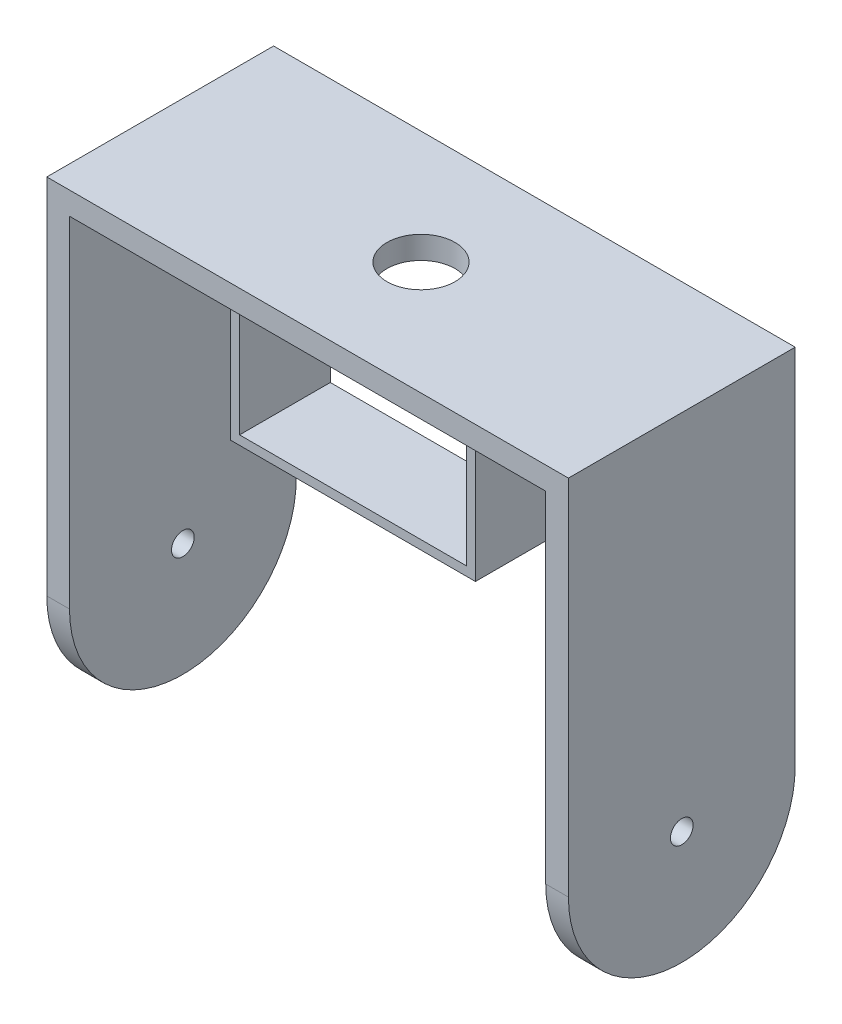
ISO-10303-21;
HEADER;
FILE_DESCRIPTION(('STEP AP214'),'2;1');
FILE_NAME('part.step','',(''),(''),'','','');
FILE_SCHEMA(('AUTOMOTIVE_DESIGN { 1 0 10303 214 1 1 1 1 }'));
ENDSEC;
DATA;
#1=APPLICATION_CONTEXT('core data for automotive mechanical design processes');
#2=APPLICATION_PROTOCOL_DEFINITION('international standard','automotive_design',2000,#1);
#3=PRODUCT_CONTEXT('',#1,'mechanical');
#4=PRODUCT('Part','Part','',(#3));
#5=PRODUCT_RELATED_PRODUCT_CATEGORY('part','',(#4));
#6=PRODUCT_DEFINITION_FORMATION('','',#4);
#7=PRODUCT_DEFINITION_CONTEXT('part definition',#1,'design');
#8=PRODUCT_DEFINITION('design','',#6,#7);
#9=PRODUCT_DEFINITION_SHAPE('','',#8);
#10=(LENGTH_UNIT() NAMED_UNIT(*) SI_UNIT(.MILLI.,.METRE.));
#11=(NAMED_UNIT(*) PLANE_ANGLE_UNIT() SI_UNIT($,.RADIAN.));
#12=(NAMED_UNIT(*) SI_UNIT($,.STERADIAN.) SOLID_ANGLE_UNIT());
#13=UNCERTAINTY_MEASURE_WITH_UNIT(LENGTH_MEASURE(1.E-05),#10,'distance_accuracy_value','');
#14=(GEOMETRIC_REPRESENTATION_CONTEXT(3) GLOBAL_UNCERTAINTY_ASSIGNED_CONTEXT((#13)) GLOBAL_UNIT_ASSIGNED_CONTEXT((#10,
#11,#12)) REPRESENTATION_CONTEXT('',''));
#15=CARTESIAN_POINT('',(0.,0.,0.));
#16=DIRECTION('',(0.,0.,1.));
#17=DIRECTION('',(1.,0.,0.));
#18=AXIS2_PLACEMENT_3D('',#15,#16,#17);
#19=CARTESIAN_POINT('',(-57.5,-2.5,-50.));
#20=DIRECTION('',(0.,-1.,0.));
#21=DIRECTION('',(0.,0.,-1.));
#22=AXIS2_PLACEMENT_3D('',#19,#20,#21);
#23=PLANE('',#22);
#24=CARTESIAN_POINT('',(0.,-2.5,-25.));
#25=DIRECTION('',(0.,-1.,0.));
#26=DIRECTION('',(0.,0.,-1.));
#27=AXIS2_PLACEMENT_3D('',#24,#25,#26);
#28=CIRCLE('',#27,7.5);
#29=CARTESIAN_POINT('',(0.,-2.5,-32.5));
#30=VERTEX_POINT('',#29);
#31=EDGE_CURVE('E215',#30,#30,#28,.T.);
#32=ORIENTED_EDGE('',*,*,#31,.F.);
#33=EDGE_LOOP('',(#32));
#34=FACE_BOUND('',#33,.T.);
#35=DIRECTION('',(1.,0.,0.));
#36=VECTOR('',#35,1.);
#37=CARTESIAN_POINT('',(-57.5,-2.5,-50.));
#38=LINE('',#37,#36);
#39=CARTESIAN_POINT('',(-52.5,-2.5,-50.));
#40=VERTEX_POINT('',#39);
#41=CARTESIAN_POINT('',(52.5,-2.5,-50.));
#42=VERTEX_POINT('',#41);
#43=EDGE_CURVE('E270',#40,#42,#38,.T.);
#44=ORIENTED_EDGE('',*,*,#43,.T.);
#45=DIRECTION('',(0.,0.,-1.));
#46=VECTOR('',#45,1.);
#47=CARTESIAN_POINT('',(52.5,-2.5,0.));
#48=LINE('',#47,#46);
#49=CARTESIAN_POINT('',(52.5,-2.5,0.));
#50=VERTEX_POINT('',#49);
#51=EDGE_CURVE('E246',#50,#42,#48,.T.);
#52=ORIENTED_EDGE('',*,*,#51,.F.);
#53=DIRECTION('',(1.,0.,0.));
#54=VECTOR('',#53,1.);
#55=CARTESIAN_POINT('',(-57.5,-2.5,0.));
#56=LINE('',#55,#54);
#57=CARTESIAN_POINT('',(-52.5,-2.5,0.));
#58=VERTEX_POINT('',#57);
#59=EDGE_CURVE('E264',#58,#50,#56,.T.);
#60=ORIENTED_EDGE('',*,*,#59,.F.);
#61=DIRECTION('',(0.,0.,1.));
#62=VECTOR('',#61,1.);
#63=CARTESIAN_POINT('',(-52.5,-2.5,0.));
#64=LINE('',#63,#62);
#65=EDGE_CURVE('E253',#40,#58,#64,.T.);
#66=ORIENTED_EDGE('',*,*,#65,.F.);
#67=EDGE_LOOP('',(#44,#52,#60,#66));
#68=FACE_BOUND('',#67,.T.);
#69=DIRECTION('',(-1.,0.,0.));
#70=VECTOR('',#69,1.);
#71=CARTESIAN_POINT('',(20.,-2.5,-15.));
#72=LINE('',#71,#70);
#73=CARTESIAN_POINT('',(22.,-2.5,-15.));
#74=VERTEX_POINT('',#73);
#75=CARTESIAN_POINT('',(20.,-2.5,-15.));
#76=VERTEX_POINT('',#75);
#77=EDGE_CURVE('E203',#74,#76,#72,.T.);
#78=ORIENTED_EDGE('',*,*,#77,.F.);
#79=DIRECTION('',(0.,0.,1.));
#80=VECTOR('',#79,1.);
#81=CARTESIAN_POINT('',(22.,-2.5,-15.));
#82=LINE('',#81,#80);
#83=CARTESIAN_POINT('',(22.,-2.5,-35.));
#84=VERTEX_POINT('',#83);
#85=EDGE_CURVE('E191',#84,#74,#82,.T.);
#86=ORIENTED_EDGE('',*,*,#85,.F.);
#87=DIRECTION('',(1.,0.,0.));
#88=VECTOR('',#87,1.);
#89=CARTESIAN_POINT('',(20.,-2.5,-35.));
#90=LINE('',#89,#88);
#91=CARTESIAN_POINT('',(20.,-2.5,-35.));
#92=VERTEX_POINT('',#91);
#93=EDGE_CURVE('E196',#92,#84,#90,.T.);
#94=ORIENTED_EDGE('',*,*,#93,.F.);
#95=DIRECTION('',(0.,0.,-1.));
#96=VECTOR('',#95,1.);
#97=CARTESIAN_POINT('',(20.,-2.5,-15.));
#98=LINE('',#97,#96);
#99=EDGE_CURVE('E205',#76,#92,#98,.T.);
#100=ORIENTED_EDGE('',*,*,#99,.F.);
#101=EDGE_LOOP('',(#78,#86,#94,#100));
#102=FACE_BOUND('',#101,.T.);
#103=DIRECTION('',(0.,0.,-1.));
#104=VECTOR('',#103,1.);
#105=CARTESIAN_POINT('',(-32.,-2.49999999999773,-15.0000000000868));
#106=LINE('',#105,#104);
#107=CARTESIAN_POINT('',(-32.,-2.49999999999773,-15.));
#108=VERTEX_POINT('',#107);
#109=CARTESIAN_POINT('',(-32.,-2.5,-35.));
#110=VERTEX_POINT('',#109);
#111=EDGE_CURVE('E154',#108,#110,#106,.T.);
#112=ORIENTED_EDGE('',*,*,#111,.F.);
#113=DIRECTION('',(-1.,0.,0.));
#114=VECTOR('',#113,1.);
#115=CARTESIAN_POINT('',(-32.,-2.49999999999773,-15.));
#116=LINE('',#115,#114);
#117=CARTESIAN_POINT('',(-30.,-2.49999999999773,-15.));
#118=VERTEX_POINT('',#117);
#119=EDGE_CURVE('E163',#118,#108,#116,.T.);
#120=ORIENTED_EDGE('',*,*,#119,.F.);
#121=DIRECTION('',(0.,0.,1.));
#122=VECTOR('',#121,1.);
#123=CARTESIAN_POINT('',(-30.,-2.49999999999773,-15.0000000000868));
#124=LINE('',#123,#122);
#125=CARTESIAN_POINT('',(-30.,-2.49999999999773,-35.));
#126=VERTEX_POINT('',#125);
#127=EDGE_CURVE('E170',#126,#118,#124,.T.);
#128=ORIENTED_EDGE('',*,*,#127,.F.);
#129=DIRECTION('',(1.,0.,0.));
#130=VECTOR('',#129,1.);
#131=CARTESIAN_POINT('',(-32.,-2.49999999999773,-35.));
#132=LINE('',#131,#130);
#133=EDGE_CURVE('E172',#110,#126,#132,.T.);
#134=ORIENTED_EDGE('',*,*,#133,.F.);
#135=EDGE_LOOP('',(#112,#120,#128,#134));
#136=FACE_BOUND('',#135,.T.);
#137=ADVANCED_FACE('F37',(#34,#68,#102,#136),#23,.T.);
#138=CARTESIAN_POINT('',(-32.,-40.5,-15.));
#139=DIRECTION('',(0.,-1.,0.));
#140=DIRECTION('',(0.,0.,-1.));
#141=AXIS2_PLACEMENT_3D('',#138,#139,#140);
#142=PLANE('',#141);
#143=DIRECTION('',(0.,0.,-1.));
#144=VECTOR('',#143,1.);
#145=CARTESIAN_POINT('',(-30.,-40.5,-15.));
#146=LINE('',#145,#144);
#147=CARTESIAN_POINT('',(-30.,-40.5,-15.));
#148=VERTEX_POINT('',#147);
#149=CARTESIAN_POINT('',(-30.,-40.5,-35.));
#150=VERTEX_POINT('',#149);
#151=EDGE_CURVE('E177',#148,#150,#146,.T.);
#152=ORIENTED_EDGE('',*,*,#151,.F.);
#153=DIRECTION('',(1.,0.,0.));
#154=VECTOR('',#153,1.);
#155=CARTESIAN_POINT('',(-32.,-40.5,-15.));
#156=LINE('',#155,#154);
#157=CARTESIAN_POINT('',(20.,-40.5,-15.));
#158=VERTEX_POINT('',#157);
#159=EDGE_CURVE('E189',#148,#158,#156,.T.);
#160=ORIENTED_EDGE('',*,*,#159,.T.);
#161=DIRECTION('',(0.,0.,-1.));
#162=VECTOR('',#161,1.);
#163=CARTESIAN_POINT('',(20.,-40.5,-15.));
#164=LINE('',#163,#162);
#165=CARTESIAN_POINT('',(20.,-40.5,-35.));
#166=VERTEX_POINT('',#165);
#167=EDGE_CURVE('E159',#158,#166,#164,.T.);
#168=ORIENTED_EDGE('',*,*,#167,.T.);
#169=DIRECTION('',(1.,0.,0.));
#170=VECTOR('',#169,1.);
#171=CARTESIAN_POINT('',(-32.,-40.5,-35.));
#172=LINE('',#171,#170);
#173=EDGE_CURVE('E185',#150,#166,#172,.T.);
#174=ORIENTED_EDGE('',*,*,#173,.F.);
#175=EDGE_LOOP('',(#152,#160,#168,#174));
#176=FACE_BOUND('',#175,.T.);
#177=ADVANCED_FACE('F323',(#176),#142,.F.);
#178=CARTESIAN_POINT('',(20.,-42.5,-15.));
#179=DIRECTION('',(1.,0.,0.));
#180=DIRECTION('',(0.,0.,-1.));
#181=AXIS2_PLACEMENT_3D('',#178,#179,#180);
#182=PLANE('',#181);
#183=ORIENTED_EDGE('',*,*,#167,.F.);
#184=DIRECTION('',(0.,1.,0.));
#185=VECTOR('',#184,1.);
#186=CARTESIAN_POINT('',(20.,-42.5,-15.));
#187=LINE('',#186,#185);
#188=EDGE_CURVE('E211',#158,#76,#187,.T.);
#189=ORIENTED_EDGE('',*,*,#188,.T.);
#190=ORIENTED_EDGE('',*,*,#99,.T.);
#191=DIRECTION('',(0.,1.,0.));
#192=VECTOR('',#191,1.);
#193=CARTESIAN_POINT('',(20.,-42.5,-35.));
#194=LINE('',#193,#192);
#195=EDGE_CURVE('E61',#166,#92,#194,.T.);
#196=ORIENTED_EDGE('',*,*,#195,.F.);
#197=EDGE_LOOP('',(#183,#189,#190,#196));
#198=FACE_BOUND('',#197,.T.);
#199=ADVANCED_FACE('F351',(#198),#182,.F.);
#200=CARTESIAN_POINT('',(57.5,2.5,-50.));
#201=DIRECTION('',(1.,0.,0.));
#202=DIRECTION('',(0.,0.,-1.));
#203=AXIS2_PLACEMENT_3D('',#200,#201,#202);
#204=PLANE('',#203);
#205=CARTESIAN_POINT('',(57.5,-77.5,-25.));
#206=DIRECTION('',(-1.,0.,0.));
#207=DIRECTION('',(0.,0.,1.));
#208=AXIS2_PLACEMENT_3D('',#205,#206,#207);
#209=CIRCLE('',#208,2.5);
#210=CARTESIAN_POINT('',(57.5,-77.5,-22.5));
#211=VERTEX_POINT('',#210);
#212=EDGE_CURVE('E222',#211,#211,#209,.T.);
#213=ORIENTED_EDGE('',*,*,#212,.T.);
#214=EDGE_LOOP('',(#213));
#215=FACE_BOUND('',#214,.T.);
#216=CARTESIAN_POINT('',(57.5,-77.5,-25.));
#217=DIRECTION('',(-1.,0.,0.));
#218=DIRECTION('',(0.,0.,1.));
#219=AXIS2_PLACEMENT_3D('',#216,#217,#218);
#220=CIRCLE('',#219,25.);
#221=CARTESIAN_POINT('',(57.5,-77.5,-50.));
#222=VERTEX_POINT('',#221);
#223=CARTESIAN_POINT('',(57.5,-77.5,0.));
#224=VERTEX_POINT('',#223);
#225=EDGE_CURVE('E235',#222,#224,#220,.T.);
#226=ORIENTED_EDGE('',*,*,#225,.F.);
#227=DIRECTION('',(0.,1.,0.));
#228=VECTOR('',#227,1.);
#229=CARTESIAN_POINT('',(57.5,2.5,-50.));
#230=LINE('',#229,#228);
#231=CARTESIAN_POINT('',(57.5,2.5,-50.));
#232=VERTEX_POINT('',#231);
#233=EDGE_CURVE('E261',#222,#232,#230,.T.);
#234=ORIENTED_EDGE('',*,*,#233,.T.);
#235=DIRECTION('',(0.,0.,1.));
#236=VECTOR('',#235,1.);
#237=CARTESIAN_POINT('',(57.5,2.5,-50.));
#238=LINE('',#237,#236);
#239=CARTESIAN_POINT('',(57.5,2.5,0.));
#240=VERTEX_POINT('',#239);
#241=EDGE_CURVE('E46',#232,#240,#238,.T.);
#242=ORIENTED_EDGE('',*,*,#241,.T.);
#243=DIRECTION('',(0.,1.,0.));
#244=VECTOR('',#243,1.);
#245=CARTESIAN_POINT('',(57.5,2.5,0.));
#246=LINE('',#245,#244);
#247=EDGE_CURVE('E260',#224,#240,#246,.T.);
#248=ORIENTED_EDGE('',*,*,#247,.F.);
#249=EDGE_LOOP('',(#226,#234,#242,#248));
#250=FACE_BOUND('',#249,.T.);
#251=ADVANCED_FACE('F39',(#215,#250),#204,.T.);
#252=CARTESIAN_POINT('',(-57.5,2.5,-50.));
#253=DIRECTION('',(-1.,0.,0.));
#254=DIRECTION('',(0.,0.,1.));
#255=AXIS2_PLACEMENT_3D('',#252,#253,#254);
#256=PLANE('',#255);
#257=CARTESIAN_POINT('',(-57.5,-77.5,-25.));
#258=DIRECTION('',(-1.,0.,0.));
#259=DIRECTION('',(0.,0.,1.));
#260=AXIS2_PLACEMENT_3D('',#257,#258,#259);
#261=CIRCLE('',#260,2.5);
#262=CARTESIAN_POINT('',(-57.5,-77.5,-22.5));
#263=VERTEX_POINT('',#262);
#264=EDGE_CURVE('E219',#263,#263,#261,.T.);
#265=ORIENTED_EDGE('',*,*,#264,.F.);
#266=EDGE_LOOP('',(#265));
#267=FACE_BOUND('',#266,.T.);
#268=DIRECTION('',(0.,-1.,0.));
#269=VECTOR('',#268,1.);
#270=CARTESIAN_POINT('',(-57.5,2.5,-50.));
#271=LINE('',#270,#269);
#272=CARTESIAN_POINT('',(-57.5,2.5,-50.));
#273=VERTEX_POINT('',#272);
#274=CARTESIAN_POINT('',(-57.5,-77.5,-50.));
#275=VERTEX_POINT('',#274);
#276=EDGE_CURVE('E267',#273,#275,#271,.T.);
#277=ORIENTED_EDGE('',*,*,#276,.T.);
#278=CARTESIAN_POINT('',(-57.5,-77.5,-25.));
#279=DIRECTION('',(-1.,0.,0.));
#280=DIRECTION('',(0.,0.,1.));
#281=AXIS2_PLACEMENT_3D('',#278,#279,#280);
#282=CIRCLE('',#281,25.);
#283=CARTESIAN_POINT('',(-57.5,-77.5,0.));
#284=VERTEX_POINT('',#283);
#285=EDGE_CURVE('E234',#275,#284,#282,.T.);
#286=ORIENTED_EDGE('',*,*,#285,.T.);
#287=DIRECTION('',(0.,-1.,0.));
#288=VECTOR('',#287,1.);
#289=CARTESIAN_POINT('',(-57.5,2.5,0.));
#290=LINE('',#289,#288);
#291=CARTESIAN_POINT('',(-57.5,2.5,0.));
#292=VERTEX_POINT('',#291);
#293=EDGE_CURVE('E277',#292,#284,#290,.T.);
#294=ORIENTED_EDGE('',*,*,#293,.F.);
#295=DIRECTION('',(0.,0.,1.));
#296=VECTOR('',#295,1.);
#297=CARTESIAN_POINT('',(-57.5,2.5,-50.));
#298=LINE('',#297,#296);
#299=EDGE_CURVE('E11',#273,#292,#298,.T.);
#300=ORIENTED_EDGE('',*,*,#299,.F.);
#301=EDGE_LOOP('',(#277,#286,#294,#300));
#302=FACE_BOUND('',#301,.T.);
#303=ADVANCED_FACE('F312',(#267,#302),#256,.T.);
#304=CARTESIAN_POINT('',(-52.5,-102.5,0.));
#305=DIRECTION('',(-1.,0.,0.));
#306=DIRECTION('',(0.,0.,1.));
#307=AXIS2_PLACEMENT_3D('',#304,#305,#306);
#308=PLANE('',#307);
#309=CARTESIAN_POINT('',(-52.5,-77.5,-25.));
#310=DIRECTION('',(-1.,0.,0.));
#311=DIRECTION('',(0.,0.,1.));
#312=AXIS2_PLACEMENT_3D('',#309,#310,#311);
#313=CIRCLE('',#312,2.5);
#314=CARTESIAN_POINT('',(-52.5,-77.5,-22.5));
#315=VERTEX_POINT('',#314);
#316=EDGE_CURVE('E227',#315,#315,#313,.T.);
#317=ORIENTED_EDGE('',*,*,#316,.T.);
#318=EDGE_LOOP('',(#317));
#319=FACE_BOUND('',#318,.T.);
#320=CARTESIAN_POINT('',(-52.5,-77.5,-25.));
#321=DIRECTION('',(-1.,0.,0.));
#322=DIRECTION('',(0.,0.,1.));
#323=AXIS2_PLACEMENT_3D('',#320,#321,#322);
#324=CIRCLE('',#323,25.);
#325=CARTESIAN_POINT('',(-52.5,-77.5,-50.));
#326=VERTEX_POINT('',#325);
#327=CARTESIAN_POINT('',(-52.5,-77.5,0.));
#328=VERTEX_POINT('',#327);
#329=EDGE_CURVE('E244',#326,#328,#324,.T.);
#330=ORIENTED_EDGE('',*,*,#329,.F.);
#331=DIRECTION('',(0.,1.,0.));
#332=VECTOR('',#331,1.);
#333=CARTESIAN_POINT('',(-52.5,-102.5,-50.));
#334=LINE('',#333,#332);
#335=EDGE_CURVE('E258',#326,#40,#334,.T.);
#336=ORIENTED_EDGE('',*,*,#335,.T.);
#337=ORIENTED_EDGE('',*,*,#65,.T.);
#338=DIRECTION('',(0.,1.,0.));
#339=VECTOR('',#338,1.);
#340=CARTESIAN_POINT('',(-52.5,-102.5,0.));
#341=LINE('',#340,#339);
#342=EDGE_CURVE('E256',#328,#58,#341,.T.);
#343=ORIENTED_EDGE('',*,*,#342,.F.);
#344=EDGE_LOOP('',(#330,#336,#337,#343));
#345=FACE_BOUND('',#344,.T.);
#346=ADVANCED_FACE('F318',(#319,#345),#308,.F.);
#347=CARTESIAN_POINT('',(52.5,-102.5,0.));
#348=DIRECTION('',(1.,0.,0.));
#349=DIRECTION('',(0.,0.,-1.));
#350=AXIS2_PLACEMENT_3D('',#347,#348,#349);
#351=PLANE('',#350);
#352=CARTESIAN_POINT('',(52.5,-77.5,-25.));
#353=DIRECTION('',(1.,0.,0.));
#354=DIRECTION('',(0.,0.,-1.));
#355=AXIS2_PLACEMENT_3D('',#352,#353,#354);
#356=CIRCLE('',#355,2.5);
#357=CARTESIAN_POINT('',(52.5,-77.5,-27.5));
#358=VERTEX_POINT('',#357);
#359=EDGE_CURVE('E41',#358,#358,#356,.T.);
#360=ORIENTED_EDGE('',*,*,#359,.T.);
#361=EDGE_LOOP('',(#360));
#362=FACE_BOUND('',#361,.T.);
#363=DIRECTION('',(0.,1.,0.));
#364=VECTOR('',#363,1.);
#365=CARTESIAN_POINT('',(52.5,-102.5,-50.));
#366=LINE('',#365,#364);
#367=CARTESIAN_POINT('',(52.5,-77.5,-50.));
#368=VERTEX_POINT('',#367);
#369=EDGE_CURVE('E249',#368,#42,#366,.T.);
#370=ORIENTED_EDGE('',*,*,#369,.F.);
#371=CARTESIAN_POINT('',(52.5,-77.5,-25.));
#372=DIRECTION('',(1.,0.,0.));
#373=DIRECTION('',(0.,0.,-1.));
#374=AXIS2_PLACEMENT_3D('',#371,#372,#373);
#375=CIRCLE('',#374,25.);
#376=CARTESIAN_POINT('',(52.5,-77.5,0.));
#377=VERTEX_POINT('',#376);
#378=EDGE_CURVE('E242',#377,#368,#375,.T.);
#379=ORIENTED_EDGE('',*,*,#378,.F.);
#380=DIRECTION('',(0.,1.,0.));
#381=VECTOR('',#380,1.);
#382=CARTESIAN_POINT('',(52.5,-102.5,0.));
#383=LINE('',#382,#381);
#384=EDGE_CURVE('E251',#377,#50,#383,.T.);
#385=ORIENTED_EDGE('',*,*,#384,.T.);
#386=ORIENTED_EDGE('',*,*,#51,.T.);
#387=EDGE_LOOP('',(#370,#379,#385,#386));
#388=FACE_BOUND('',#387,.T.);
#389=ADVANCED_FACE('F302',(#362,#388),#351,.F.);
#390=CARTESIAN_POINT('',(-57.5,2.5,-50.));
#391=DIRECTION('',(0.,1.,0.));
#392=DIRECTION('',(0.,0.,1.));
#393=AXIS2_PLACEMENT_3D('',#390,#391,#392);
#394=PLANE('',#393);
#395=CARTESIAN_POINT('',(0.,2.5,-25.));
#396=DIRECTION('',(0.,-1.,0.));
#397=DIRECTION('',(0.,0.,-1.));
#398=AXIS2_PLACEMENT_3D('',#395,#396,#397);
#399=CIRCLE('',#398,7.5);
#400=CARTESIAN_POINT('',(0.,2.5,-32.5));
#401=VERTEX_POINT('',#400);
#402=EDGE_CURVE('E216',#401,#401,#399,.T.);
#403=ORIENTED_EDGE('',*,*,#402,.T.);
#404=EDGE_LOOP('',(#403));
#405=FACE_BOUND('',#404,.T.);
#406=DIRECTION('',(-1.,0.,0.));
#407=VECTOR('',#406,1.);
#408=CARTESIAN_POINT('',(-57.5,2.5,0.));
#409=LINE('',#408,#407);
#410=EDGE_CURVE('E274',#240,#292,#409,.T.);
#411=ORIENTED_EDGE('',*,*,#410,.F.);
#412=ORIENTED_EDGE('',*,*,#241,.F.);
#413=DIRECTION('',(-1.,0.,0.));
#414=VECTOR('',#413,1.);
#415=CARTESIAN_POINT('',(-57.5,2.5,-50.));
#416=LINE('',#415,#414);
#417=EDGE_CURVE('E263',#232,#273,#416,.T.);
#418=ORIENTED_EDGE('',*,*,#417,.T.);
#419=ORIENTED_EDGE('',*,*,#299,.T.);
#420=EDGE_LOOP('',(#411,#412,#418,#419));
#421=FACE_BOUND('',#420,.T.);
#422=ADVANCED_FACE('F289',(#405,#421),#394,.T.);
#423=CARTESIAN_POINT('',(0.,0.,-50.));
#424=DIRECTION('',(0.,0.,1.));
#425=DIRECTION('',(1.,0.,0.));
#426=AXIS2_PLACEMENT_3D('',#423,#424,#425);
#427=PLANE('',#426);
#428=ORIENTED_EDGE('',*,*,#233,.F.);
#429=DIRECTION('',(-1.,0.,0.));
#430=VECTOR('',#429,1.);
#431=CARTESIAN_POINT('',(57.5,-77.5,-50.));
#432=LINE('',#431,#430);
#433=EDGE_CURVE('E231',#222,#368,#432,.T.);
#434=ORIENTED_EDGE('',*,*,#433,.T.);
#435=ORIENTED_EDGE('',*,*,#369,.T.);
#436=ORIENTED_EDGE('',*,*,#43,.F.);
#437=ORIENTED_EDGE('',*,*,#335,.F.);
#438=EDGE_CURVE('E230',#326,#275,#432,.T.);
#439=ORIENTED_EDGE('',*,*,#438,.T.);
#440=ORIENTED_EDGE('',*,*,#276,.F.);
#441=ORIENTED_EDGE('',*,*,#417,.F.);
#442=EDGE_LOOP('',(#428,#434,#435,#436,#437,#439,#440,#441));
#443=FACE_BOUND('',#442,.T.);
#444=ADVANCED_FACE('F306',(#443),#427,.F.);
#445=CARTESIAN_POINT('',(0.,0.,0.));
#446=DIRECTION('',(0.,0.,1.));
#447=DIRECTION('',(1.,0.,0.));
#448=AXIS2_PLACEMENT_3D('',#445,#446,#447);
#449=PLANE('',#448);
#450=DIRECTION('',(-1.,0.,0.));
#451=VECTOR('',#450,1.);
#452=CARTESIAN_POINT('',(57.5,-77.5,0.));
#453=LINE('',#452,#451);
#454=EDGE_CURVE('E240',#224,#377,#453,.T.);
#455=ORIENTED_EDGE('',*,*,#454,.F.);
#456=ORIENTED_EDGE('',*,*,#247,.T.);
#457=ORIENTED_EDGE('',*,*,#410,.T.);
#458=ORIENTED_EDGE('',*,*,#293,.T.);
#459=EDGE_CURVE('E237',#328,#284,#453,.T.);
#460=ORIENTED_EDGE('',*,*,#459,.F.);
#461=ORIENTED_EDGE('',*,*,#342,.T.);
#462=ORIENTED_EDGE('',*,*,#59,.T.);
#463=ORIENTED_EDGE('',*,*,#384,.F.);
#464=EDGE_LOOP('',(#455,#456,#457,#458,#460,#461,#462,#463));
#465=FACE_BOUND('',#464,.T.);
#466=ADVANCED_FACE('F293',(#465),#449,.T.);
#467=CARTESIAN_POINT('',(57.5,-77.5,-25.));
#468=DIRECTION('',(-1.,0.,0.));
#469=DIRECTION('',(0.,0.,1.));
#470=AXIS2_PLACEMENT_3D('',#467,#468,#469);
#471=CYLINDRICAL_SURFACE('',#470,25.);
#472=ORIENTED_EDGE('',*,*,#378,.T.);
#473=ORIENTED_EDGE('',*,*,#433,.F.);
#474=ORIENTED_EDGE('',*,*,#225,.T.);
#475=ORIENTED_EDGE('',*,*,#454,.T.);
#476=EDGE_LOOP('',(#472,#473,#474,#475));
#477=FACE_BOUND('',#476,.T.);
#478=ADVANCED_FACE('F298',(#477),#471,.T.);
#479=ORIENTED_EDGE('',*,*,#329,.T.);
#480=ORIENTED_EDGE('',*,*,#459,.T.);
#481=ORIENTED_EDGE('',*,*,#285,.F.);
#482=ORIENTED_EDGE('',*,*,#438,.F.);
#483=EDGE_LOOP('',(#479,#480,#481,#482));
#484=FACE_BOUND('',#483,.T.);
#485=ADVANCED_FACE('F314',(#484),#471,.T.);
#486=CARTESIAN_POINT('',(57.5,-77.5,-25.));
#487=DIRECTION('',(-1.,0.,0.));
#488=DIRECTION('',(0.,0.,1.));
#489=AXIS2_PLACEMENT_3D('',#486,#487,#488);
#490=CYLINDRICAL_SURFACE('',#489,2.5);
#491=ORIENTED_EDGE('',*,*,#212,.F.);
#492=EDGE_LOOP('',(#491));
#493=FACE_BOUND('',#492,.T.);
#494=ORIENTED_EDGE('',*,*,#359,.F.);
#495=EDGE_LOOP('',(#494));
#496=FACE_BOUND('',#495,.T.);
#497=ADVANCED_FACE('F365',(#493,#496),#490,.F.);
#498=ORIENTED_EDGE('',*,*,#264,.T.);
#499=EDGE_LOOP('',(#498));
#500=FACE_BOUND('',#499,.T.);
#501=ORIENTED_EDGE('',*,*,#316,.F.);
#502=EDGE_LOOP('',(#501));
#503=FACE_BOUND('',#502,.T.);
#504=ADVANCED_FACE('F361',(#500,#503),#490,.F.);
#505=CARTESIAN_POINT('',(0.,2.5,-25.));
#506=DIRECTION('',(0.,-1.,0.));
#507=DIRECTION('',(0.,0.,-1.));
#508=AXIS2_PLACEMENT_3D('',#505,#506,#507);
#509=CYLINDRICAL_SURFACE('',#508,7.5);
#510=ORIENTED_EDGE('',*,*,#402,.F.);
#511=EDGE_LOOP('',(#510));
#512=FACE_BOUND('',#511,.T.);
#513=ORIENTED_EDGE('',*,*,#31,.T.);
#514=EDGE_LOOP('',(#513));
#515=FACE_BOUND('',#514,.T.);
#516=ADVANCED_FACE('F358',(#512,#515),#509,.F.);
#517=CARTESIAN_POINT('',(22.,-42.5,-15.));
#518=DIRECTION('',(-1.,0.,0.));
#519=DIRECTION('',(0.,0.,1.));
#520=AXIS2_PLACEMENT_3D('',#517,#518,#519);
#521=PLANE('',#520);
#522=ORIENTED_EDGE('',*,*,#85,.T.);
#523=DIRECTION('',(0.,1.,0.));
#524=VECTOR('',#523,1.);
#525=CARTESIAN_POINT('',(22.,-42.5,-15.));
#526=LINE('',#525,#524);
#527=CARTESIAN_POINT('',(22.,-42.5,-15.));
#528=VERTEX_POINT('',#527);
#529=EDGE_CURVE('E213',#528,#74,#526,.T.);
#530=ORIENTED_EDGE('',*,*,#529,.F.);
#531=DIRECTION('',(0.,0.,1.));
#532=VECTOR('',#531,1.);
#533=CARTESIAN_POINT('',(22.,-42.5,-15.));
#534=LINE('',#533,#532);
#535=CARTESIAN_POINT('',(22.,-42.5,-35.));
#536=VERTEX_POINT('',#535);
#537=EDGE_CURVE('E192',#536,#528,#534,.T.);
#538=ORIENTED_EDGE('',*,*,#537,.F.);
#539=DIRECTION('',(0.,1.,0.));
#540=VECTOR('',#539,1.);
#541=CARTESIAN_POINT('',(22.,-42.5,-35.));
#542=LINE('',#541,#540);
#543=EDGE_CURVE('E200',#536,#84,#542,.T.);
#544=ORIENTED_EDGE('',*,*,#543,.T.);
#545=EDGE_LOOP('',(#522,#530,#538,#544));
#546=FACE_BOUND('',#545,.T.);
#547=ADVANCED_FACE('F334',(#546),#521,.F.);
#548=CARTESIAN_POINT('',(20.,-42.5,-15.));
#549=DIRECTION('',(0.,0.,-1.));
#550=DIRECTION('',(-1.,0.,0.));
#551=AXIS2_PLACEMENT_3D('',#548,#549,#550);
#552=PLANE('',#551);
#553=ORIENTED_EDGE('',*,*,#77,.T.);
#554=ORIENTED_EDGE('',*,*,#188,.F.);
#555=ORIENTED_EDGE('',*,*,#159,.F.);
#556=DIRECTION('',(0.,-1.,0.));
#557=VECTOR('',#556,1.);
#558=CARTESIAN_POINT('',(-30.,500000.,-15.0000000000868));
#559=LINE('',#558,#557);
#560=EDGE_CURVE('E167',#118,#148,#559,.T.);
#561=ORIENTED_EDGE('',*,*,#560,.F.);
#562=ORIENTED_EDGE('',*,*,#119,.T.);
#563=DIRECTION('',(0.,1.,0.));
#564=VECTOR('',#563,1.);
#565=CARTESIAN_POINT('',(-32.,-42.5,-15.));
#566=LINE('',#565,#564);
#567=CARTESIAN_POINT('',(-32.,-42.5,-15.));
#568=VERTEX_POINT('',#567);
#569=EDGE_CURVE('E150',#568,#108,#566,.T.);
#570=ORIENTED_EDGE('',*,*,#569,.F.);
#571=DIRECTION('',(-1.,0.,0.));
#572=VECTOR('',#571,1.);
#573=CARTESIAN_POINT('',(20.,-42.5,-15.));
#574=LINE('',#573,#572);
#575=EDGE_CURVE('E195',#528,#568,#574,.T.);
#576=ORIENTED_EDGE('',*,*,#575,.F.);
#577=ORIENTED_EDGE('',*,*,#529,.T.);
#578=EDGE_LOOP('',(#553,#554,#555,#561,#562,#570,#576,#577));
#579=FACE_BOUND('',#578,.T.);
#580=ADVANCED_FACE('F165',(#579),#552,.F.);
#581=CARTESIAN_POINT('',(20.,-42.5,-35.));
#582=DIRECTION('',(0.,0.,1.));
#583=DIRECTION('',(1.,0.,0.));
#584=AXIS2_PLACEMENT_3D('',#581,#582,#583);
#585=PLANE('',#584);
#586=ORIENTED_EDGE('',*,*,#93,.T.);
#587=ORIENTED_EDGE('',*,*,#543,.F.);
#588=DIRECTION('',(1.,0.,0.));
#589=VECTOR('',#588,1.);
#590=CARTESIAN_POINT('',(20.,-42.5,-35.));
#591=LINE('',#590,#589);
#592=CARTESIAN_POINT('',(-32.,-42.5,-35.));
#593=VERTEX_POINT('',#592);
#594=EDGE_CURVE('E198',#593,#536,#591,.T.);
#595=ORIENTED_EDGE('',*,*,#594,.F.);
#596=DIRECTION('',(0.,-1.,0.));
#597=VECTOR('',#596,1.);
#598=CARTESIAN_POINT('',(-32.,-42.5,-35.));
#599=LINE('',#598,#597);
#600=EDGE_CURVE('E54',#110,#593,#599,.T.);
#601=ORIENTED_EDGE('',*,*,#600,.F.);
#602=ORIENTED_EDGE('',*,*,#133,.T.);
#603=DIRECTION('',(0.,-1.,0.));
#604=VECTOR('',#603,1.);
#605=CARTESIAN_POINT('',(-30.,500000.,-35.0000000000868));
#606=LINE('',#605,#604);
#607=EDGE_CURVE('E180',#126,#150,#606,.T.);
#608=ORIENTED_EDGE('',*,*,#607,.T.);
#609=ORIENTED_EDGE('',*,*,#173,.T.);
#610=ORIENTED_EDGE('',*,*,#195,.T.);
#611=EDGE_LOOP('',(#586,#587,#595,#601,#602,#608,#609,#610));
#612=FACE_BOUND('',#611,.T.);
#613=ADVANCED_FACE('F336',(#612),#585,.F.);
#614=CARTESIAN_POINT('',(0.,-42.5,0.));
#615=DIRECTION('',(0.,-1.,0.));
#616=DIRECTION('',(0.,0.,-1.));
#617=AXIS2_PLACEMENT_3D('',#614,#615,#616);
#618=PLANE('',#617);
#619=ORIENTED_EDGE('',*,*,#537,.T.);
#620=ORIENTED_EDGE('',*,*,#575,.T.);
#621=DIRECTION('',(0.,0.,1.));
#622=VECTOR('',#621,1.);
#623=CARTESIAN_POINT('',(-32.,-42.5,-15.));
#624=LINE('',#623,#622);
#625=EDGE_CURVE('E157',#593,#568,#624,.T.);
#626=ORIENTED_EDGE('',*,*,#625,.F.);
#627=ORIENTED_EDGE('',*,*,#594,.T.);
#628=EDGE_LOOP('',(#619,#620,#626,#627));
#629=FACE_BOUND('',#628,.T.);
#630=ADVANCED_FACE('F338',(#629),#618,.T.);
#631=CARTESIAN_POINT('',(-32.,0.,0.));
#632=DIRECTION('',(-1.,0.,0.));
#633=DIRECTION('',(0.,0.,1.));
#634=AXIS2_PLACEMENT_3D('',#631,#632,#633);
#635=PLANE('',#634);
#636=ORIENTED_EDGE('',*,*,#569,.T.);
#637=ORIENTED_EDGE('',*,*,#111,.T.);
#638=ORIENTED_EDGE('',*,*,#600,.T.);
#639=ORIENTED_EDGE('',*,*,#625,.T.);
#640=EDGE_LOOP('',(#636,#637,#638,#639));
#641=FACE_BOUND('',#640,.T.);
#642=ADVANCED_FACE('F152',(#641),#635,.T.);
#643=CARTESIAN_POINT('',(-30.,500000.,-15.0000000000868));
#644=DIRECTION('',(-1.,0.,0.));
#645=DIRECTION('',(0.,-1.,0.));
#646=AXIS2_PLACEMENT_3D('',#643,#644,#645);
#647=PLANE('',#646);
#648=ORIENTED_EDGE('',*,*,#607,.F.);
#649=ORIENTED_EDGE('',*,*,#127,.T.);
#650=ORIENTED_EDGE('',*,*,#560,.T.);
#651=ORIENTED_EDGE('',*,*,#151,.T.);
#652=EDGE_LOOP('',(#648,#649,#650,#651));
#653=FACE_BOUND('',#652,.T.);
#654=ADVANCED_FACE('F345',(#653),#647,.F.);
#655=CLOSED_SHELL('',(#137,#177,#199,#251,#303,#346,#389,#422,#444,#466,#478,#485,#497,#504,
#516,#547,#580,#613,#630,#642,#654));
#656=MANIFOLD_SOLID_BREP('B2',#655);
#657=ADVANCED_BREP_SHAPE_REPRESENTATION('',(#18,#656),#14);
#658=SHAPE_DEFINITION_REPRESENTATION(#9,#657);
ENDSEC;
END-ISO-10303-21;
